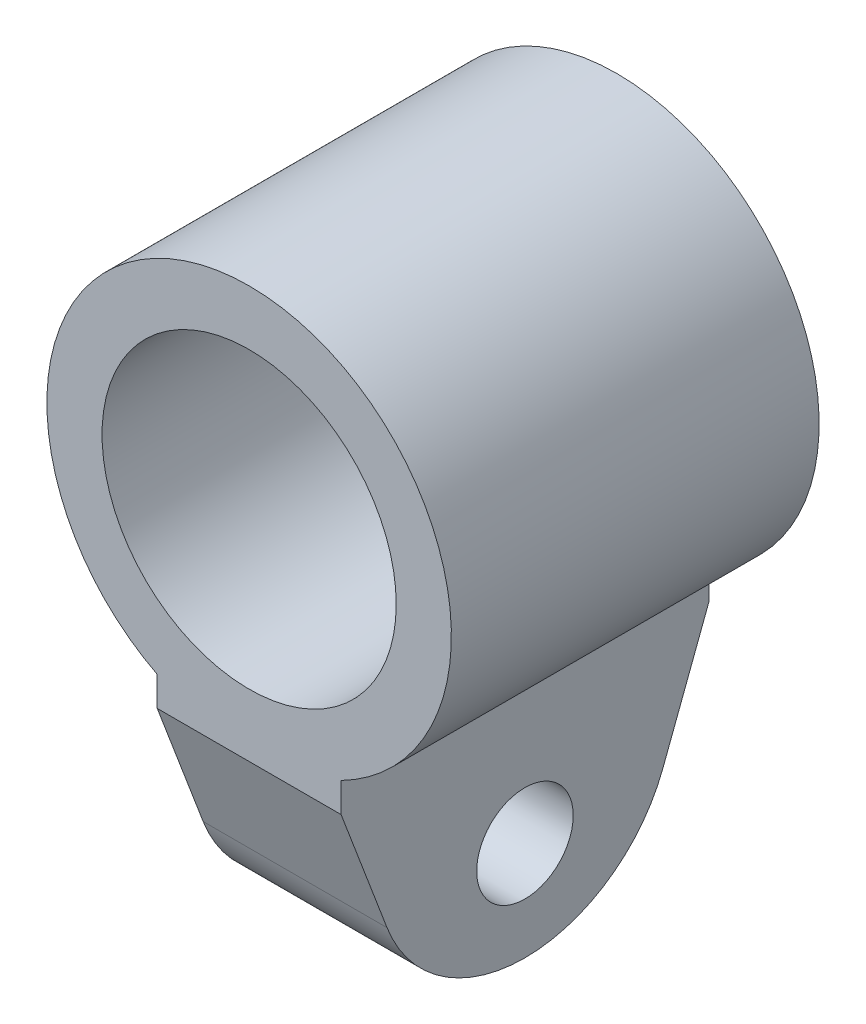
ISO-10303-21;
HEADER;
FILE_DESCRIPTION(('STEP AP214'),'2;1');
FILE_NAME('part.step','',(''),(''),'','','');
FILE_SCHEMA(('AUTOMOTIVE_DESIGN { 1 0 10303 214 1 1 1 1 }'));
ENDSEC;
DATA;
#1=APPLICATION_CONTEXT('core data for automotive mechanical design processes');
#2=APPLICATION_PROTOCOL_DEFINITION('international standard','automotive_design',2000,#1);
#3=PRODUCT_CONTEXT('',#1,'mechanical');
#4=PRODUCT('Part','Part','',(#3));
#5=PRODUCT_RELATED_PRODUCT_CATEGORY('part','',(#4));
#6=PRODUCT_DEFINITION_FORMATION('','',#4);
#7=PRODUCT_DEFINITION_CONTEXT('part definition',#1,'design');
#8=PRODUCT_DEFINITION('design','',#6,#7);
#9=PRODUCT_DEFINITION_SHAPE('','',#8);
#10=(LENGTH_UNIT() NAMED_UNIT(*) SI_UNIT(.MILLI.,.METRE.));
#11=(NAMED_UNIT(*) PLANE_ANGLE_UNIT() SI_UNIT($,.RADIAN.));
#12=(NAMED_UNIT(*) SI_UNIT($,.STERADIAN.) SOLID_ANGLE_UNIT());
#13=UNCERTAINTY_MEASURE_WITH_UNIT(LENGTH_MEASURE(1.E-05),#10,'distance_accuracy_value','');
#14=(GEOMETRIC_REPRESENTATION_CONTEXT(3) GLOBAL_UNCERTAINTY_ASSIGNED_CONTEXT((#13)) GLOBAL_UNIT_ASSIGNED_CONTEXT((#10,
#11,#12)) REPRESENTATION_CONTEXT('',''));
#15=CARTESIAN_POINT('',(0.,0.,0.));
#16=DIRECTION('',(0.,0.,1.));
#17=DIRECTION('',(1.,0.,0.));
#18=AXIS2_PLACEMENT_3D('',#15,#16,#17);
#19=CARTESIAN_POINT('',(0.,41.80685414,20.));
#20=DIRECTION('',(0.,0.,-1.));
#21=DIRECTION('',(-1.,0.,0.));
#22=AXIS2_PLACEMENT_3D('',#19,#20,#21);
#23=CYLINDRICAL_SURFACE('',#22,22.);
#24=DIRECTION('',(0.,0.,-1.));
#25=VECTOR('',#24,1.);
#26=CARTESIAN_POINT('',(10.,22.2109361977346,20.));
#27=LINE('',#26,#25);
#28=CARTESIAN_POINT('',(10.,22.2109361977346,20.));
#29=VERTEX_POINT('',#28);
#30=CARTESIAN_POINT('',(10.,22.2109361977346,-20.));
#31=VERTEX_POINT('',#30);
#32=EDGE_CURVE('E111',#29,#31,#27,.T.);
#33=ORIENTED_EDGE('',*,*,#32,.T.);
#34=CARTESIAN_POINT('',(0.,41.80685414,-20.));
#35=DIRECTION('',(0.,0.,1.));
#36=DIRECTION('',(1.,0.,0.));
#37=AXIS2_PLACEMENT_3D('',#34,#35,#36);
#38=CIRCLE('',#37,22.);
#39=CARTESIAN_POINT('',(-10.,22.2109361977346,-20.));
#40=VERTEX_POINT('',#39);
#41=EDGE_CURVE('E35',#31,#40,#38,.T.);
#42=ORIENTED_EDGE('',*,*,#41,.T.);
#43=DIRECTION('',(0.,0.,-1.));
#44=VECTOR('',#43,1.);
#45=CARTESIAN_POINT('',(-10.,22.2109361977346,20.));
#46=LINE('',#45,#44);
#47=CARTESIAN_POINT('',(-10.,22.2109361977346,20.));
#48=VERTEX_POINT('',#47);
#49=EDGE_CURVE('E107',#40,#48,#46,.F.);
#50=ORIENTED_EDGE('',*,*,#49,.T.);
#51=CARTESIAN_POINT('',(0.,41.80685414,20.));
#52=DIRECTION('',(0.,0.,1.));
#53=DIRECTION('',(1.,0.,0.));
#54=AXIS2_PLACEMENT_3D('',#51,#52,#53);
#55=CIRCLE('',#54,22.);
#56=EDGE_CURVE('E11',#29,#48,#55,.T.);
#57=ORIENTED_EDGE('',*,*,#56,.F.);
#58=EDGE_LOOP('',(#33,#42,#50,#57));
#59=FACE_BOUND('',#58,.T.);
#60=ADVANCED_FACE('F32',(#59),#23,.T.);
#61=CARTESIAN_POINT('',(0.,41.80685414,20.));
#62=DIRECTION('',(0.,0.,1.));
#63=DIRECTION('',(1.,0.,0.));
#64=AXIS2_PLACEMENT_3D('',#61,#62,#63);
#65=PLANE('',#64);
#66=ORIENTED_EDGE('',*,*,#56,.T.);
#67=DIRECTION('',(0.,-1.,0.));
#68=VECTOR('',#67,1.);
#69=CARTESIAN_POINT('',(-10.,63.80885414,20.));
#70=LINE('',#69,#68);
#71=CARTESIAN_POINT('',(-10.,19.,20.));
#72=VERTEX_POINT('',#71);
#73=EDGE_CURVE('E121',#48,#72,#70,.T.);
#74=ORIENTED_EDGE('',*,*,#73,.T.);
#75=DIRECTION('',(1.,0.,0.));
#76=VECTOR('',#75,1.);
#77=CARTESIAN_POINT('',(-10.,19.,20.));
#78=LINE('',#77,#76);
#79=CARTESIAN_POINT('',(10.,19.,20.));
#80=VERTEX_POINT('',#79);
#81=EDGE_CURVE('E117',#72,#80,#78,.T.);
#82=ORIENTED_EDGE('',*,*,#81,.T.);
#83=DIRECTION('',(0.,-1.,0.));
#84=VECTOR('',#83,1.);
#85=CARTESIAN_POINT('',(10.,63.80885414,20.));
#86=LINE('',#85,#84);
#87=EDGE_CURVE('E45',#29,#80,#86,.T.);
#88=ORIENTED_EDGE('',*,*,#87,.F.);
#89=EDGE_LOOP('',(#66,#74,#82,#88));
#90=FACE_BOUND('',#89,.T.);
#91=CARTESIAN_POINT('',(0.,41.80685414,20.));
#92=DIRECTION('',(0.,0.,1.));
#93=DIRECTION('',(1.,0.,0.));
#94=AXIS2_PLACEMENT_3D('',#91,#92,#93);
#95=CIRCLE('',#94,16.);
#96=CARTESIAN_POINT('',(16.,41.80685414,20.));
#97=VERTEX_POINT('',#96);
#98=EDGE_CURVE('E130',#97,#97,#95,.T.);
#99=ORIENTED_EDGE('',*,*,#98,.F.);
#100=EDGE_LOOP('',(#99));
#101=FACE_BOUND('',#100,.T.);
#102=ADVANCED_FACE('F148',(#90,#101),#65,.T.);
#103=CARTESIAN_POINT('',(0.,41.80685414,-20.));
#104=DIRECTION('',(0.,0.,1.));
#105=DIRECTION('',(1.,0.,0.));
#106=AXIS2_PLACEMENT_3D('',#103,#104,#105);
#107=PLANE('',#106);
#108=ORIENTED_EDGE('',*,*,#41,.F.);
#109=DIRECTION('',(0.,-1.,0.));
#110=VECTOR('',#109,1.);
#111=CARTESIAN_POINT('',(10.,63.80885414,-20.));
#112=LINE('',#111,#110);
#113=CARTESIAN_POINT('',(10.,19.,-20.));
#114=VERTEX_POINT('',#113);
#115=EDGE_CURVE('E126',#31,#114,#112,.T.);
#116=ORIENTED_EDGE('',*,*,#115,.T.);
#117=DIRECTION('',(-1.,0.,0.));
#118=VECTOR('',#117,1.);
#119=CARTESIAN_POINT('',(-10.,19.,-20.));
#120=LINE('',#119,#118);
#121=CARTESIAN_POINT('',(-10.,19.,-20.));
#122=VERTEX_POINT('',#121);
#123=EDGE_CURVE('E90',#114,#122,#120,.T.);
#124=ORIENTED_EDGE('',*,*,#123,.T.);
#125=DIRECTION('',(0.,-1.,0.));
#126=VECTOR('',#125,1.);
#127=CARTESIAN_POINT('',(-10.,63.80885414,-20.));
#128=LINE('',#127,#126);
#129=EDGE_CURVE('E124',#40,#122,#128,.T.);
#130=ORIENTED_EDGE('',*,*,#129,.F.);
#131=EDGE_LOOP('',(#108,#116,#124,#130));
#132=FACE_BOUND('',#131,.T.);
#133=CARTESIAN_POINT('',(0.,41.80685414,-20.));
#134=DIRECTION('',(0.,0.,1.));
#135=DIRECTION('',(1.,0.,0.));
#136=AXIS2_PLACEMENT_3D('',#133,#134,#135);
#137=CIRCLE('',#136,16.);
#138=CARTESIAN_POINT('',(16.,41.80685414,-20.));
#139=VERTEX_POINT('',#138);
#140=EDGE_CURVE('E119',#139,#139,#137,.T.);
#141=ORIENTED_EDGE('',*,*,#140,.T.);
#142=EDGE_LOOP('',(#141));
#143=FACE_BOUND('',#142,.T.);
#144=ADVANCED_FACE('F136',(#132,#143),#107,.F.);
#145=CARTESIAN_POINT('',(0.,41.80685414,20.));
#146=DIRECTION('',(0.,0.,-1.));
#147=DIRECTION('',(-1.,0.,0.));
#148=AXIS2_PLACEMENT_3D('',#145,#146,#147);
#149=CYLINDRICAL_SURFACE('',#148,16.);
#150=ORIENTED_EDGE('',*,*,#98,.T.);
#151=EDGE_LOOP('',(#150));
#152=FACE_BOUND('',#151,.T.);
#153=ORIENTED_EDGE('',*,*,#140,.F.);
#154=EDGE_LOOP('',(#153));
#155=FACE_BOUND('',#154,.T.);
#156=ADVANCED_FACE('F138',(#152,#155),#149,.F.);
#157=CARTESIAN_POINT('',(10.,63.80885414,-20.));
#158=DIRECTION('',(-1.,0.,0.));
#159=DIRECTION('',(0.,0.,1.));
#160=AXIS2_PLACEMENT_3D('',#157,#158,#159);
#161=PLANE('',#160);
#162=ORIENTED_EDGE('',*,*,#32,.F.);
#163=ORIENTED_EDGE('',*,*,#87,.T.);
#164=DIRECTION('',(0.,-0.934777984000658,-0.355232488136525));
#165=VECTOR('',#164,1.);
#166=CARTESIAN_POINT('',(10.,19.,20.));
#167=LINE('',#166,#165);
#168=CARTESIAN_POINT('',(10.,5.84272954728454,15.));
#169=VERTEX_POINT('',#168);
#170=EDGE_CURVE('E93',#80,#169,#167,.T.);
#171=ORIENTED_EDGE('',*,*,#170,.T.);
#172=CARTESIAN_POINT('',(10.,11.543,0.));
#173=DIRECTION('',(1.,0.,0.));
#174=DIRECTION('',(0.,0.,-1.));
#175=AXIS2_PLACEMENT_3D('',#172,#173,#174);
#176=CIRCLE('',#175,16.0465910159791);
#177=CARTESIAN_POINT('',(10.,5.84272954728454,-15.));
#178=VERTEX_POINT('',#177);
#179=EDGE_CURVE('E94',#169,#178,#176,.T.);
#180=ORIENTED_EDGE('',*,*,#179,.T.);
#181=DIRECTION('',(0.,0.934777984000658,-0.355232488136525));
#182=VECTOR('',#181,1.);
#183=CARTESIAN_POINT('',(10.,5.84272954728454,-15.));
#184=LINE('',#183,#182);
#185=EDGE_CURVE('E83',#178,#114,#184,.T.);
#186=ORIENTED_EDGE('',*,*,#185,.T.);
#187=ORIENTED_EDGE('',*,*,#115,.F.);
#188=EDGE_LOOP('',(#162,#163,#171,#180,#186,#187));
#189=FACE_BOUND('',#188,.T.);
#190=CARTESIAN_POINT('',(10.,6.293,0.));
#191=DIRECTION('',(1.,0.,0.));
#192=DIRECTION('',(0.,0.,-1.));
#193=AXIS2_PLACEMENT_3D('',#190,#191,#192);
#194=CIRCLE('',#193,5.25);
#195=CARTESIAN_POINT('',(10.,6.293,-5.25));
#196=VERTEX_POINT('',#195);
#197=EDGE_CURVE('E171',#196,#196,#194,.T.);
#198=ORIENTED_EDGE('',*,*,#197,.F.);
#199=EDGE_LOOP('',(#198));
#200=FACE_BOUND('',#199,.T.);
#201=ADVANCED_FACE('F97',(#189,#200),#161,.F.);
#202=CARTESIAN_POINT('',(-10.,63.80885414,-20.));
#203=DIRECTION('',(1.,0.,0.));
#204=DIRECTION('',(0.,0.,-1.));
#205=AXIS2_PLACEMENT_3D('',#202,#203,#204);
#206=PLANE('',#205);
#207=ORIENTED_EDGE('',*,*,#49,.F.);
#208=ORIENTED_EDGE('',*,*,#129,.T.);
#209=DIRECTION('',(0.,0.934777984000658,-0.355232488136525));
#210=VECTOR('',#209,1.);
#211=CARTESIAN_POINT('',(-10.,5.84272954728454,-15.));
#212=LINE('',#211,#210);
#213=CARTESIAN_POINT('',(-10.,5.84272954728454,-15.));
#214=VERTEX_POINT('',#213);
#215=EDGE_CURVE('E53',#214,#122,#212,.T.);
#216=ORIENTED_EDGE('',*,*,#215,.F.);
#217=CARTESIAN_POINT('',(-10.,11.543,0.));
#218=DIRECTION('',(1.,0.,0.));
#219=DIRECTION('',(0.,0.,-1.));
#220=AXIS2_PLACEMENT_3D('',#217,#218,#219);
#221=CIRCLE('',#220,16.0465910159791);
#222=CARTESIAN_POINT('',(-10.,5.84272954728454,15.));
#223=VERTEX_POINT('',#222);
#224=EDGE_CURVE('E106',#223,#214,#221,.T.);
#225=ORIENTED_EDGE('',*,*,#224,.F.);
#226=DIRECTION('',(0.,-0.934777984000658,-0.355232488136525));
#227=VECTOR('',#226,1.);
#228=CARTESIAN_POINT('',(-10.,19.,20.));
#229=LINE('',#228,#227);
#230=EDGE_CURVE('E102',#72,#223,#229,.T.);
#231=ORIENTED_EDGE('',*,*,#230,.F.);
#232=ORIENTED_EDGE('',*,*,#73,.F.);
#233=EDGE_LOOP('',(#207,#208,#216,#225,#231,#232));
#234=FACE_BOUND('',#233,.T.);
#235=CARTESIAN_POINT('',(-10.,6.293,0.));
#236=DIRECTION('',(1.,0.,0.));
#237=DIRECTION('',(0.,0.,-1.));
#238=AXIS2_PLACEMENT_3D('',#235,#236,#237);
#239=CIRCLE('',#238,5.25);
#240=CARTESIAN_POINT('',(-10.,6.293,-5.25));
#241=VERTEX_POINT('',#240);
#242=EDGE_CURVE('E173',#241,#241,#239,.T.);
#243=ORIENTED_EDGE('',*,*,#242,.T.);
#244=EDGE_LOOP('',(#243));
#245=FACE_BOUND('',#244,.T.);
#246=ADVANCED_FACE('F142',(#234,#245),#206,.F.);
#247=CARTESIAN_POINT('',(10.,11.543,0.));
#248=DIRECTION('',(-1.,0.,0.));
#249=DIRECTION('',(0.,0.,1.));
#250=AXIS2_PLACEMENT_3D('',#247,#248,#249);
#251=CYLINDRICAL_SURFACE('',#250,16.0465910159791);
#252=ORIENTED_EDGE('',*,*,#224,.T.);
#253=DIRECTION('',(-1.,0.,0.));
#254=VECTOR('',#253,1.);
#255=CARTESIAN_POINT('',(10.,5.84272954728454,-15.));
#256=LINE('',#255,#254);
#257=EDGE_CURVE('E87',#178,#214,#256,.T.);
#258=ORIENTED_EDGE('',*,*,#257,.F.);
#259=ORIENTED_EDGE('',*,*,#179,.F.);
#260=DIRECTION('',(-1.,0.,0.));
#261=VECTOR('',#260,1.);
#262=CARTESIAN_POINT('',(10.,5.84272954728454,15.));
#263=LINE('',#262,#261);
#264=EDGE_CURVE('E108',#169,#223,#263,.T.);
#265=ORIENTED_EDGE('',*,*,#264,.T.);
#266=EDGE_LOOP('',(#252,#258,#259,#265));
#267=FACE_BOUND('',#266,.T.);
#268=ADVANCED_FACE('F104',(#267),#251,.T.);
#269=CARTESIAN_POINT('',(10.,5.84272954728454,-15.));
#270=DIRECTION('',(0.,0.355232488136525,0.934777984000658));
#271=DIRECTION('',(0.,-0.934777984000658,0.355232488136525));
#272=AXIS2_PLACEMENT_3D('',#269,#270,#271);
#273=PLANE('',#272);
#274=ORIENTED_EDGE('',*,*,#215,.T.);
#275=ORIENTED_EDGE('',*,*,#123,.F.);
#276=ORIENTED_EDGE('',*,*,#185,.F.);
#277=ORIENTED_EDGE('',*,*,#257,.T.);
#278=EDGE_LOOP('',(#274,#275,#276,#277));
#279=FACE_BOUND('',#278,.T.);
#280=ADVANCED_FACE('F85',(#279),#273,.F.);
#281=CARTESIAN_POINT('',(10.,19.,20.));
#282=DIRECTION('',(0.,0.355232488136525,-0.934777984000658));
#283=DIRECTION('',(0.,0.934777984000658,0.355232488136525));
#284=AXIS2_PLACEMENT_3D('',#281,#282,#283);
#285=PLANE('',#284);
#286=ORIENTED_EDGE('',*,*,#230,.T.);
#287=ORIENTED_EDGE('',*,*,#264,.F.);
#288=ORIENTED_EDGE('',*,*,#170,.F.);
#289=ORIENTED_EDGE('',*,*,#81,.F.);
#290=EDGE_LOOP('',(#286,#287,#288,#289));
#291=FACE_BOUND('',#290,.T.);
#292=ADVANCED_FACE('F167',(#291),#285,.F.);
#293=CARTESIAN_POINT('',(10.,6.293,0.));
#294=DIRECTION('',(-1.,0.,0.));
#295=DIRECTION('',(0.,0.,1.));
#296=AXIS2_PLACEMENT_3D('',#293,#294,#295);
#297=CYLINDRICAL_SURFACE('',#296,5.25);
#298=ORIENTED_EDGE('',*,*,#197,.T.);
#299=EDGE_LOOP('',(#298));
#300=FACE_BOUND('',#299,.T.);
#301=ORIENTED_EDGE('',*,*,#242,.F.);
#302=EDGE_LOOP('',(#301));
#303=FACE_BOUND('',#302,.T.);
#304=ADVANCED_FACE('F179',(#300,#303),#297,.F.);
#305=CLOSED_SHELL('',(#60,#102,#144,#156,#201,#246,#268,#280,#292,#304));
#306=MANIFOLD_SOLID_BREP('B2',#305);
#307=ADVANCED_BREP_SHAPE_REPRESENTATION('',(#18,#306),#14);
#308=SHAPE_DEFINITION_REPRESENTATION(#9,#307);
ENDSEC;
END-ISO-10303-21;
